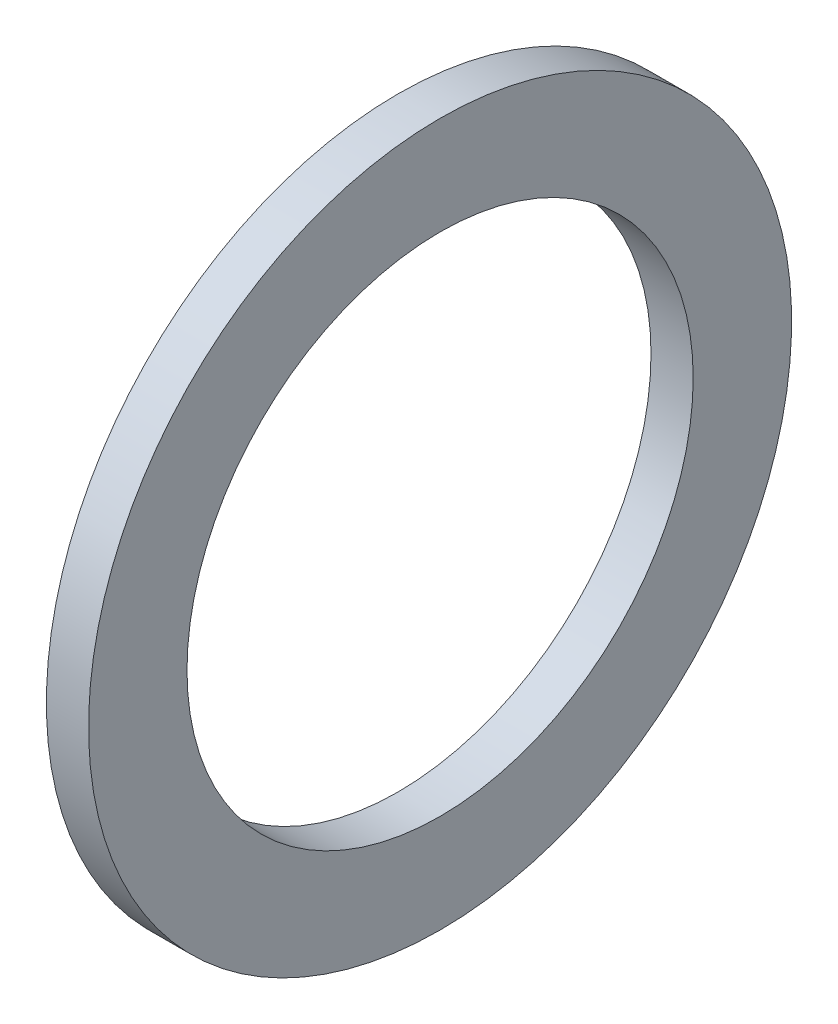
ISO-10303-21;
HEADER;
FILE_DESCRIPTION(('STEP AP214'),'2;1');
FILE_NAME('part.step','',(''),(''),'','','');
FILE_SCHEMA(('AUTOMOTIVE_DESIGN { 1 0 10303 214 1 1 1 1 }'));
ENDSEC;
DATA;
#1=APPLICATION_CONTEXT('core data for automotive mechanical design processes');
#2=APPLICATION_PROTOCOL_DEFINITION('international standard','automotive_design',2000,#1);
#3=PRODUCT_CONTEXT('',#1,'mechanical');
#4=PRODUCT('Part','Part','',(#3));
#5=PRODUCT_RELATED_PRODUCT_CATEGORY('part','',(#4));
#6=PRODUCT_DEFINITION_FORMATION('','',#4);
#7=PRODUCT_DEFINITION_CONTEXT('part definition',#1,'design');
#8=PRODUCT_DEFINITION('design','',#6,#7);
#9=PRODUCT_DEFINITION_SHAPE('','',#8);
#10=(LENGTH_UNIT() NAMED_UNIT(*) SI_UNIT(.MILLI.,.METRE.));
#11=(NAMED_UNIT(*) PLANE_ANGLE_UNIT() SI_UNIT($,.RADIAN.));
#12=(NAMED_UNIT(*) SI_UNIT($,.STERADIAN.) SOLID_ANGLE_UNIT());
#13=UNCERTAINTY_MEASURE_WITH_UNIT(LENGTH_MEASURE(1.E-05),#10,'distance_accuracy_value','');
#14=(GEOMETRIC_REPRESENTATION_CONTEXT(3) GLOBAL_UNCERTAINTY_ASSIGNED_CONTEXT((#13)) GLOBAL_UNIT_ASSIGNED_CONTEXT((#10,
#11,#12)) REPRESENTATION_CONTEXT('',''));
#15=CARTESIAN_POINT('',(0.,0.,0.));
#16=DIRECTION('',(0.,0.,1.));
#17=DIRECTION('',(1.,0.,0.));
#18=AXIS2_PLACEMENT_3D('',#15,#16,#17);
#19=CARTESIAN_POINT('',(0.,0.,0.));
#20=DIRECTION('',(-1.,0.,0.));
#21=DIRECTION('',(0.,0.,1.));
#22=AXIS2_PLACEMENT_3D('',#19,#20,#21);
#23=PLANE('',#22);
#24=CARTESIAN_POINT('',(0.,0.,0.));
#25=DIRECTION('',(1.,0.,0.));
#26=DIRECTION('',(0.,-1.,0.));
#27=AXIS2_PLACEMENT_3D('',#24,#25,#26);
#28=CIRCLE('',#27,9.);
#29=CARTESIAN_POINT('',(0.,9.,0.));
#30=VERTEX_POINT('',#29);
#31=EDGE_CURVE('E59',#30,#30,#28,.T.);
#32=ORIENTED_EDGE('',*,*,#31,.T.);
#33=EDGE_LOOP('',(#32));
#34=FACE_BOUND('',#33,.T.);
#35=CARTESIAN_POINT('',(0.,0.,0.));
#36=DIRECTION('',(-1.,0.,0.));
#37=DIRECTION('',(0.,-1.,0.));
#38=AXIS2_PLACEMENT_3D('',#35,#36,#37);
#39=CIRCLE('',#38,12.5);
#40=CARTESIAN_POINT('',(0.,12.5,0.));
#41=VERTEX_POINT('',#40);
#42=EDGE_CURVE('E11',#41,#41,#39,.T.);
#43=ORIENTED_EDGE('',*,*,#42,.T.);
#44=EDGE_LOOP('',(#43));
#45=FACE_BOUND('',#44,.T.);
#46=ADVANCED_FACE('F17',(#34,#45),#23,.T.);
#47=CARTESIAN_POINT('',(1.5,0.,0.));
#48=DIRECTION('',(-1.,0.,0.));
#49=DIRECTION('',(0.,0.,1.));
#50=AXIS2_PLACEMENT_3D('',#47,#48,#49);
#51=PLANE('',#50);
#52=CARTESIAN_POINT('',(1.5,0.,0.));
#53=DIRECTION('',(-1.,0.,0.));
#54=DIRECTION('',(0.,-1.,0.));
#55=AXIS2_PLACEMENT_3D('',#52,#53,#54);
#56=CIRCLE('',#55,9.);
#57=CARTESIAN_POINT('',(1.5,9.,0.));
#58=VERTEX_POINT('',#57);
#59=EDGE_CURVE('E60',#58,#58,#56,.T.);
#60=ORIENTED_EDGE('',*,*,#59,.T.);
#61=EDGE_LOOP('',(#60));
#62=FACE_BOUND('',#61,.T.);
#63=CARTESIAN_POINT('',(1.5,0.,0.));
#64=DIRECTION('',(-1.,0.,0.));
#65=DIRECTION('',(0.,-1.,0.));
#66=AXIS2_PLACEMENT_3D('',#63,#64,#65);
#67=CIRCLE('',#66,12.5);
#68=CARTESIAN_POINT('',(1.5,12.5,0.));
#69=VERTEX_POINT('',#68);
#70=EDGE_CURVE('E21',#69,#69,#67,.T.);
#71=ORIENTED_EDGE('',*,*,#70,.F.);
#72=EDGE_LOOP('',(#71));
#73=FACE_BOUND('',#72,.T.);
#74=ADVANCED_FACE('F19',(#62,#73),#51,.F.);
#75=CARTESIAN_POINT('',(0.,0.,0.));
#76=DIRECTION('',(1.,0.,0.));
#77=DIRECTION('',(0.,-1.,0.));
#78=AXIS2_PLACEMENT_3D('',#75,#76,#77);
#79=CYLINDRICAL_SURFACE('',#78,12.5);
#80=ORIENTED_EDGE('',*,*,#70,.T.);
#81=DIRECTION('',(-1.,0.,0.));
#82=VECTOR('',#81,1.);
#83=CARTESIAN_POINT('',(0.,12.5,0.));
#84=LINE('',#83,#82);
#85=EDGE_CURVE('E27',#69,#41,#84,.T.);
#86=ORIENTED_EDGE('',*,*,#85,.T.);
#87=ORIENTED_EDGE('',*,*,#42,.F.);
#88=ORIENTED_EDGE('',*,*,#85,.F.);
#89=EDGE_LOOP('',(#80,#86,#87,#88));
#90=FACE_BOUND('',#89,.T.);
#91=ADVANCED_FACE('F77',(#90),#79,.T.);
#92=CARTESIAN_POINT('',(0.,0.,0.));
#93=DIRECTION('',(1.,0.,0.));
#94=DIRECTION('',(0.,-1.,0.));
#95=AXIS2_PLACEMENT_3D('',#92,#93,#94);
#96=CYLINDRICAL_SURFACE('',#95,9.);
#97=ORIENTED_EDGE('',*,*,#31,.F.);
#98=DIRECTION('',(1.,0.,0.));
#99=VECTOR('',#98,1.);
#100=CARTESIAN_POINT('',(0.,9.,0.));
#101=LINE('',#100,#99);
#102=EDGE_CURVE('E56',#30,#58,#101,.T.);
#103=ORIENTED_EDGE('',*,*,#102,.T.);
#104=ORIENTED_EDGE('',*,*,#59,.F.);
#105=ORIENTED_EDGE('',*,*,#102,.F.);
#106=EDGE_LOOP('',(#97,#103,#104,#105));
#107=FACE_BOUND('',#106,.T.);
#108=ADVANCED_FACE('F58',(#107),#96,.F.);
#109=CLOSED_SHELL('',(#46,#74,#91,#108));
#110=MANIFOLD_SOLID_BREP('B1',#109);
#111=ADVANCED_BREP_SHAPE_REPRESENTATION('',(#18,#110),#14);
#112=SHAPE_DEFINITION_REPRESENTATION(#9,#111);
ENDSEC;
END-ISO-10303-21;
